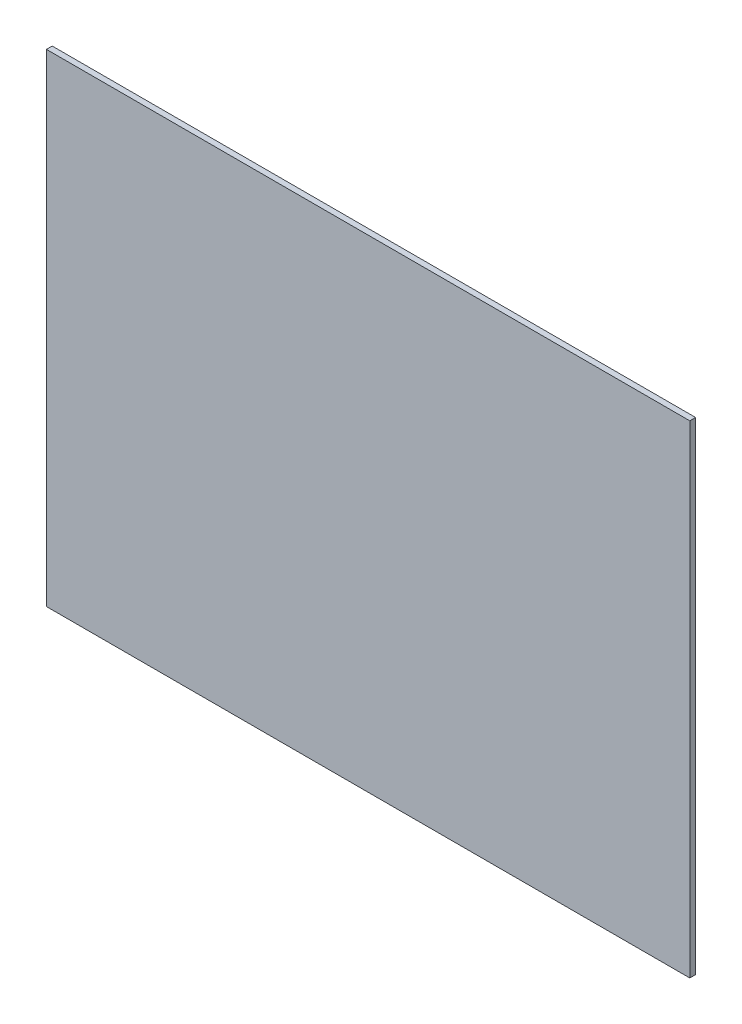
ISO-10303-21;
HEADER;
FILE_DESCRIPTION(('STEP AP214'),'2;1');
FILE_NAME('part.step','',(''),(''),'','','');
FILE_SCHEMA(('AUTOMOTIVE_DESIGN { 1 0 10303 214 1 1 1 1 }'));
ENDSEC;
DATA;
#1=APPLICATION_CONTEXT('core data for automotive mechanical design processes');
#2=APPLICATION_PROTOCOL_DEFINITION('international standard','automotive_design',2000,#1);
#3=PRODUCT_CONTEXT('',#1,'mechanical');
#4=PRODUCT('Part','Part','',(#3));
#5=PRODUCT_RELATED_PRODUCT_CATEGORY('part','',(#4));
#6=PRODUCT_DEFINITION_FORMATION('','',#4);
#7=PRODUCT_DEFINITION_CONTEXT('part definition',#1,'design');
#8=PRODUCT_DEFINITION('design','',#6,#7);
#9=PRODUCT_DEFINITION_SHAPE('','',#8);
#10=(LENGTH_UNIT() NAMED_UNIT(*) SI_UNIT(.MILLI.,.METRE.));
#11=(NAMED_UNIT(*) PLANE_ANGLE_UNIT() SI_UNIT($,.RADIAN.));
#12=(NAMED_UNIT(*) SI_UNIT($,.STERADIAN.) SOLID_ANGLE_UNIT());
#13=UNCERTAINTY_MEASURE_WITH_UNIT(LENGTH_MEASURE(1.E-05),#10,'distance_accuracy_value','');
#14=(GEOMETRIC_REPRESENTATION_CONTEXT(3) GLOBAL_UNCERTAINTY_ASSIGNED_CONTEXT((#13)) GLOBAL_UNIT_ASSIGNED_CONTEXT((#10,
#11,#12)) REPRESENTATION_CONTEXT('',''));
#15=CARTESIAN_POINT('',(0.,0.,0.));
#16=DIRECTION('',(0.,0.,1.));
#17=DIRECTION('',(1.,0.,0.));
#18=AXIS2_PLACEMENT_3D('',#15,#16,#17);
#19=CARTESIAN_POINT('',(200.,150.,3.6));
#20=DIRECTION('',(-1.,0.,0.));
#21=DIRECTION('',(0.,0.,1.));
#22=AXIS2_PLACEMENT_3D('',#19,#20,#21);
#23=PLANE('',#22);
#24=DIRECTION('',(0.,1.,0.));
#25=VECTOR('',#24,1.);
#26=CARTESIAN_POINT('',(200.,150.,0.));
#27=LINE('',#26,#25);
#28=CARTESIAN_POINT('',(200.,-150.,0.));
#29=VERTEX_POINT('',#28);
#30=CARTESIAN_POINT('',(200.,150.,0.));
#31=VERTEX_POINT('',#30);
#32=EDGE_CURVE('E96',#29,#31,#27,.T.);
#33=ORIENTED_EDGE('',*,*,#32,.T.);
#34=DIRECTION('',(0.,0.,-1.));
#35=VECTOR('',#34,1.);
#36=CARTESIAN_POINT('',(200.,150.,3.6));
#37=LINE('',#36,#35);
#38=CARTESIAN_POINT('',(200.,150.,3.6));
#39=VERTEX_POINT('',#38);
#40=EDGE_CURVE('E11',#39,#31,#37,.T.);
#41=ORIENTED_EDGE('',*,*,#40,.F.);
#42=DIRECTION('',(0.,1.,0.));
#43=VECTOR('',#42,1.);
#44=CARTESIAN_POINT('',(200.,150.,3.6));
#45=LINE('',#44,#43);
#46=CARTESIAN_POINT('',(200.,-150.,3.6));
#47=VERTEX_POINT('',#46);
#48=EDGE_CURVE('E84',#47,#39,#45,.T.);
#49=ORIENTED_EDGE('',*,*,#48,.F.);
#50=DIRECTION('',(0.,0.,-1.));
#51=VECTOR('',#50,1.);
#52=CARTESIAN_POINT('',(200.,-150.,3.6));
#53=LINE('',#52,#51);
#54=EDGE_CURVE('E92',#47,#29,#53,.T.);
#55=ORIENTED_EDGE('',*,*,#54,.T.);
#56=EDGE_LOOP('',(#33,#41,#49,#55));
#57=FACE_BOUND('',#56,.T.);
#58=ADVANCED_FACE('F33',(#57),#23,.F.);
#59=CARTESIAN_POINT('',(-200.,150.,3.6));
#60=DIRECTION('',(0.,-1.,0.));
#61=DIRECTION('',(0.,0.,-1.));
#62=AXIS2_PLACEMENT_3D('',#59,#60,#61);
#63=PLANE('',#62);
#64=DIRECTION('',(-1.,0.,0.));
#65=VECTOR('',#64,1.);
#66=CARTESIAN_POINT('',(-200.,150.,0.));
#67=LINE('',#66,#65);
#68=CARTESIAN_POINT('',(-200.,150.,0.));
#69=VERTEX_POINT('',#68);
#70=EDGE_CURVE('E88',#31,#69,#67,.T.);
#71=ORIENTED_EDGE('',*,*,#70,.T.);
#72=DIRECTION('',(0.,0.,-1.));
#73=VECTOR('',#72,1.);
#74=CARTESIAN_POINT('',(-200.,150.,3.6));
#75=LINE('',#74,#73);
#76=CARTESIAN_POINT('',(-200.,150.,3.6));
#77=VERTEX_POINT('',#76);
#78=EDGE_CURVE('E41',#77,#69,#75,.T.);
#79=ORIENTED_EDGE('',*,*,#78,.F.);
#80=DIRECTION('',(-1.,0.,0.));
#81=VECTOR('',#80,1.);
#82=CARTESIAN_POINT('',(-200.,150.,3.6));
#83=LINE('',#82,#81);
#84=EDGE_CURVE('E79',#39,#77,#83,.T.);
#85=ORIENTED_EDGE('',*,*,#84,.F.);
#86=ORIENTED_EDGE('',*,*,#40,.T.);
#87=EDGE_LOOP('',(#71,#79,#85,#86));
#88=FACE_BOUND('',#87,.T.);
#89=ADVANCED_FACE('F87',(#88),#63,.F.);
#90=CARTESIAN_POINT('',(-200.,150.,3.6));
#91=DIRECTION('',(1.,0.,0.));
#92=DIRECTION('',(0.,1.,0.));
#93=AXIS2_PLACEMENT_3D('',#90,#91,#92);
#94=PLANE('',#93);
#95=DIRECTION('',(0.,-1.,0.));
#96=VECTOR('',#95,1.);
#97=CARTESIAN_POINT('',(-200.,150.,0.));
#98=LINE('',#97,#96);
#99=CARTESIAN_POINT('',(-200.,-150.,0.));
#100=VERTEX_POINT('',#99);
#101=EDGE_CURVE('E66',#69,#100,#98,.T.);
#102=ORIENTED_EDGE('',*,*,#101,.T.);
#103=DIRECTION('',(0.,0.,-1.));
#104=VECTOR('',#103,1.);
#105=CARTESIAN_POINT('',(-200.,-150.,3.6));
#106=LINE('',#105,#104);
#107=CARTESIAN_POINT('',(-200.,-150.,3.6));
#108=VERTEX_POINT('',#107);
#109=EDGE_CURVE('E89',#108,#100,#106,.T.);
#110=ORIENTED_EDGE('',*,*,#109,.F.);
#111=DIRECTION('',(0.,-1.,0.));
#112=VECTOR('',#111,1.);
#113=CARTESIAN_POINT('',(-200.,150.,3.6));
#114=LINE('',#113,#112);
#115=EDGE_CURVE('E82',#77,#108,#114,.T.);
#116=ORIENTED_EDGE('',*,*,#115,.F.);
#117=ORIENTED_EDGE('',*,*,#78,.T.);
#118=EDGE_LOOP('',(#102,#110,#116,#117));
#119=FACE_BOUND('',#118,.T.);
#120=ADVANCED_FACE('F90',(#119),#94,.F.);
#121=CARTESIAN_POINT('',(-200.,-150.,3.6));
#122=DIRECTION('',(0.,1.,0.));
#123=DIRECTION('',(0.,0.,1.));
#124=AXIS2_PLACEMENT_3D('',#121,#122,#123);
#125=PLANE('',#124);
#126=DIRECTION('',(1.,0.,0.));
#127=VECTOR('',#126,1.);
#128=CARTESIAN_POINT('',(-200.,-150.,0.));
#129=LINE('',#128,#127);
#130=EDGE_CURVE('E72',#100,#29,#129,.T.);
#131=ORIENTED_EDGE('',*,*,#130,.T.);
#132=ORIENTED_EDGE('',*,*,#54,.F.);
#133=DIRECTION('',(1.,0.,0.));
#134=VECTOR('',#133,1.);
#135=CARTESIAN_POINT('',(-200.,-150.,3.6));
#136=LINE('',#135,#134);
#137=EDGE_CURVE('E49',#108,#47,#136,.T.);
#138=ORIENTED_EDGE('',*,*,#137,.F.);
#139=ORIENTED_EDGE('',*,*,#109,.T.);
#140=EDGE_LOOP('',(#131,#132,#138,#139));
#141=FACE_BOUND('',#140,.T.);
#142=ADVANCED_FACE('F103',(#141),#125,.F.);
#143=CARTESIAN_POINT('',(0.,0.,3.6));
#144=DIRECTION('',(0.,0.,1.));
#145=DIRECTION('',(1.,0.,0.));
#146=AXIS2_PLACEMENT_3D('',#143,#144,#145);
#147=PLANE('',#146);
#148=ORIENTED_EDGE('',*,*,#48,.T.);
#149=ORIENTED_EDGE('',*,*,#84,.T.);
#150=ORIENTED_EDGE('',*,*,#115,.T.);
#151=ORIENTED_EDGE('',*,*,#137,.T.);
#152=EDGE_LOOP('',(#148,#149,#150,#151));
#153=FACE_BOUND('',#152,.T.);
#154=ADVANCED_FACE('F80',(#153),#147,.T.);
#155=CARTESIAN_POINT('',(0.,0.,0.));
#156=DIRECTION('',(0.,0.,1.));
#157=DIRECTION('',(1.,0.,0.));
#158=AXIS2_PLACEMENT_3D('',#155,#156,#157);
#159=PLANE('',#158);
#160=ORIENTED_EDGE('',*,*,#32,.F.);
#161=ORIENTED_EDGE('',*,*,#130,.F.);
#162=ORIENTED_EDGE('',*,*,#101,.F.);
#163=ORIENTED_EDGE('',*,*,#70,.F.);
#164=EDGE_LOOP('',(#160,#161,#162,#163));
#165=FACE_BOUND('',#164,.T.);
#166=ADVANCED_FACE('F106',(#165),#159,.F.);
#167=CLOSED_SHELL('',(#58,#89,#120,#142,#154,#166));
#168=MANIFOLD_SOLID_BREP('B2',#167);
#169=ADVANCED_BREP_SHAPE_REPRESENTATION('',(#18,#168),#14);
#170=SHAPE_DEFINITION_REPRESENTATION(#9,#169);
ENDSEC;
END-ISO-10303-21;
